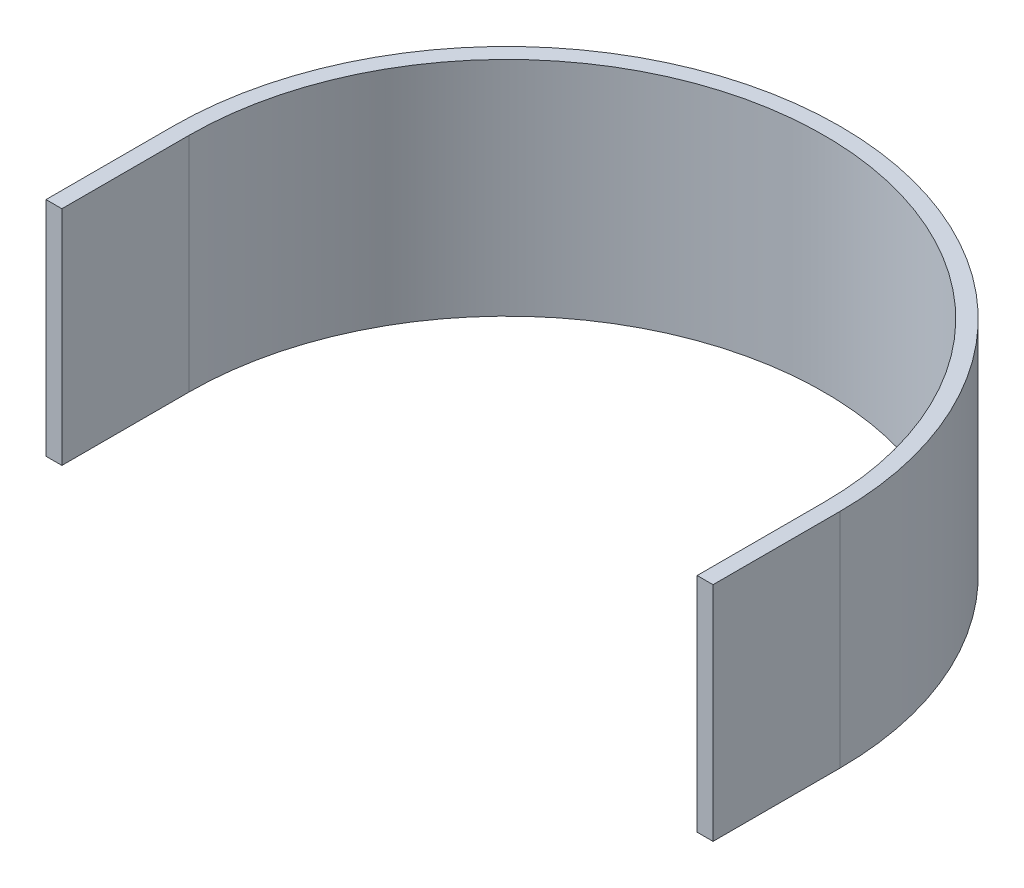
ISO-10303-21;
HEADER;
FILE_DESCRIPTION(('STEP AP214'),'2;1');
FILE_NAME('part.step','',(''),(''),'','','');
FILE_SCHEMA(('AUTOMOTIVE_DESIGN { 1 0 10303 214 1 1 1 1 }'));
ENDSEC;
DATA;
#1=APPLICATION_CONTEXT('core data for automotive mechanical design processes');
#2=APPLICATION_PROTOCOL_DEFINITION('international standard','automotive_design',2000,#1);
#3=PRODUCT_CONTEXT('',#1,'mechanical');
#4=PRODUCT('Part','Part','',(#3));
#5=PRODUCT_RELATED_PRODUCT_CATEGORY('part','',(#4));
#6=PRODUCT_DEFINITION_FORMATION('','',#4);
#7=PRODUCT_DEFINITION_CONTEXT('part definition',#1,'design');
#8=PRODUCT_DEFINITION('design','',#6,#7);
#9=PRODUCT_DEFINITION_SHAPE('','',#8);
#10=(LENGTH_UNIT() NAMED_UNIT(*) SI_UNIT(.MILLI.,.METRE.));
#11=(NAMED_UNIT(*) PLANE_ANGLE_UNIT() SI_UNIT($,.RADIAN.));
#12=(NAMED_UNIT(*) SI_UNIT($,.STERADIAN.) SOLID_ANGLE_UNIT());
#13=UNCERTAINTY_MEASURE_WITH_UNIT(LENGTH_MEASURE(1.E-05),#10,'distance_accuracy_value','');
#14=(GEOMETRIC_REPRESENTATION_CONTEXT(3) GLOBAL_UNCERTAINTY_ASSIGNED_CONTEXT((#13)) GLOBAL_UNIT_ASSIGNED_CONTEXT((#10,
#11,#12)) REPRESENTATION_CONTEXT('',''));
#15=CARTESIAN_POINT('',(0.,0.,0.));
#16=DIRECTION('',(0.,0.,1.));
#17=DIRECTION('',(1.,0.,0.));
#18=AXIS2_PLACEMENT_3D('',#15,#16,#17);
#19=CARTESIAN_POINT('',(0.,44.45,0.));
#20=DIRECTION('',(0.,-1.,0.));
#21=DIRECTION('',(0.,0.,-1.));
#22=AXIS2_PLACEMENT_3D('',#19,#20,#21);
#23=CYLINDRICAL_SURFACE('',#22,66.675);
#24=CARTESIAN_POINT('',(0.,0.,0.));
#25=DIRECTION('',(0.,1.,0.));
#26=DIRECTION('',(0.,0.,1.));
#27=AXIS2_PLACEMENT_3D('',#24,#25,#26);
#28=CIRCLE('',#27,66.675);
#29=CARTESIAN_POINT('',(-66.675,0.,0.));
#30=VERTEX_POINT('',#29);
#31=CARTESIAN_POINT('',(66.675,0.,0.));
#32=VERTEX_POINT('',#31);
#33=EDGE_CURVE('E129',#30,#32,#28,.F.);
#34=ORIENTED_EDGE('',*,*,#33,.F.);
#35=DIRECTION('',(0.,-1.,0.));
#36=VECTOR('',#35,1.);
#37=CARTESIAN_POINT('',(-66.675,44.45,0.));
#38=LINE('',#37,#36);
#39=CARTESIAN_POINT('',(-66.675,44.45,0.));
#40=VERTEX_POINT('',#39);
#41=EDGE_CURVE('E11',#40,#30,#38,.T.);
#42=ORIENTED_EDGE('',*,*,#41,.F.);
#43=CARTESIAN_POINT('',(0.,44.45,0.));
#44=DIRECTION('',(0.,1.,0.));
#45=DIRECTION('',(0.,0.,1.));
#46=AXIS2_PLACEMENT_3D('',#43,#44,#45);
#47=CIRCLE('',#46,66.675);
#48=CARTESIAN_POINT('',(66.675,44.45,0.));
#49=VERTEX_POINT('',#48);
#50=EDGE_CURVE('E147',#40,#49,#47,.F.);
#51=ORIENTED_EDGE('',*,*,#50,.T.);
#52=DIRECTION('',(0.,-1.,0.));
#53=VECTOR('',#52,1.);
#54=CARTESIAN_POINT('',(66.675,44.45,0.));
#55=LINE('',#54,#53);
#56=EDGE_CURVE('E87',#49,#32,#55,.T.);
#57=ORIENTED_EDGE('',*,*,#56,.T.);
#58=EDGE_LOOP('',(#34,#42,#51,#57));
#59=FACE_BOUND('',#58,.T.);
#60=ADVANCED_FACE('F36',(#59),#23,.T.);
#61=CARTESIAN_POINT('',(-66.675,44.45,0.));
#62=DIRECTION('',(-1.,0.,0.));
#63=DIRECTION('',(0.,0.,1.));
#64=AXIS2_PLACEMENT_3D('',#61,#62,#63);
#65=PLANE('',#64);
#66=DIRECTION('',(0.,0.,-1.));
#67=VECTOR('',#66,1.);
#68=CARTESIAN_POINT('',(-66.675,0.,0.));
#69=LINE('',#68,#67);
#70=CARTESIAN_POINT('',(-66.675,0.,25.4));
#71=VERTEX_POINT('',#70);
#72=EDGE_CURVE('E132',#71,#30,#69,.T.);
#73=ORIENTED_EDGE('',*,*,#72,.F.);
#74=DIRECTION('',(0.,-1.,0.));
#75=VECTOR('',#74,1.);
#76=CARTESIAN_POINT('',(-66.675,44.45,25.4));
#77=LINE('',#76,#75);
#78=CARTESIAN_POINT('',(-66.675,44.45,25.4));
#79=VERTEX_POINT('',#78);
#80=EDGE_CURVE('E44',#79,#71,#77,.T.);
#81=ORIENTED_EDGE('',*,*,#80,.F.);
#82=DIRECTION('',(0.,0.,-1.));
#83=VECTOR('',#82,1.);
#84=CARTESIAN_POINT('',(-66.675,44.45,0.));
#85=LINE('',#84,#83);
#86=EDGE_CURVE('E173',#79,#40,#85,.T.);
#87=ORIENTED_EDGE('',*,*,#86,.T.);
#88=ORIENTED_EDGE('',*,*,#41,.T.);
#89=EDGE_LOOP('',(#73,#81,#87,#88));
#90=FACE_BOUND('',#89,.T.);
#91=ADVANCED_FACE('F164',(#90),#65,.T.);
#92=CARTESIAN_POINT('',(0.,44.45,25.4));
#93=DIRECTION('',(0.,0.,1.));
#94=DIRECTION('',(1.,0.,0.));
#95=AXIS2_PLACEMENT_3D('',#92,#93,#94);
#96=PLANE('',#95);
#97=DIRECTION('',(-1.,0.,0.));
#98=VECTOR('',#97,1.);
#99=CARTESIAN_POINT('',(0.,0.,25.4));
#100=LINE('',#99,#98);
#101=CARTESIAN_POINT('',(-63.5,0.,25.4));
#102=VERTEX_POINT('',#101);
#103=EDGE_CURVE('E135',#102,#71,#100,.T.);
#104=ORIENTED_EDGE('',*,*,#103,.F.);
#105=DIRECTION('',(0.,-1.,0.));
#106=VECTOR('',#105,1.);
#107=CARTESIAN_POINT('',(-63.5,44.45,25.4));
#108=LINE('',#107,#106);
#109=CARTESIAN_POINT('',(-63.5,44.45,25.4));
#110=VERTEX_POINT('',#109);
#111=EDGE_CURVE('E153',#110,#102,#108,.T.);
#112=ORIENTED_EDGE('',*,*,#111,.F.);
#113=DIRECTION('',(-1.,0.,0.));
#114=VECTOR('',#113,1.);
#115=CARTESIAN_POINT('',(0.,44.45,25.4));
#116=LINE('',#115,#114);
#117=EDGE_CURVE('E160',#110,#79,#116,.T.);
#118=ORIENTED_EDGE('',*,*,#117,.T.);
#119=ORIENTED_EDGE('',*,*,#80,.T.);
#120=EDGE_LOOP('',(#104,#112,#118,#119));
#121=FACE_BOUND('',#120,.T.);
#122=ADVANCED_FACE('F158',(#121),#96,.T.);
#123=CARTESIAN_POINT('',(-63.5,44.45,0.));
#124=DIRECTION('',(1.,0.,0.));
#125=DIRECTION('',(0.,0.,-1.));
#126=AXIS2_PLACEMENT_3D('',#123,#124,#125);
#127=PLANE('',#126);
#128=DIRECTION('',(0.,0.,1.));
#129=VECTOR('',#128,1.);
#130=CARTESIAN_POINT('',(-63.5,0.,0.));
#131=LINE('',#130,#129);
#132=CARTESIAN_POINT('',(-63.5,0.,0.));
#133=VERTEX_POINT('',#132);
#134=EDGE_CURVE('E138',#133,#102,#131,.T.);
#135=ORIENTED_EDGE('',*,*,#134,.F.);
#136=DIRECTION('',(0.,-1.,0.));
#137=VECTOR('',#136,1.);
#138=CARTESIAN_POINT('',(-63.5,44.45,0.));
#139=LINE('',#138,#137);
#140=CARTESIAN_POINT('',(-63.5,44.45,0.));
#141=VERTEX_POINT('',#140);
#142=EDGE_CURVE('E151',#141,#133,#139,.T.);
#143=ORIENTED_EDGE('',*,*,#142,.F.);
#144=DIRECTION('',(0.,0.,1.));
#145=VECTOR('',#144,1.);
#146=CARTESIAN_POINT('',(-63.5,44.45,0.));
#147=LINE('',#146,#145);
#148=EDGE_CURVE('E172',#141,#110,#147,.T.);
#149=ORIENTED_EDGE('',*,*,#148,.T.);
#150=ORIENTED_EDGE('',*,*,#111,.T.);
#151=EDGE_LOOP('',(#135,#143,#149,#150));
#152=FACE_BOUND('',#151,.T.);
#153=ADVANCED_FACE('F170',(#152),#127,.T.);
#154=CARTESIAN_POINT('',(0.,44.45,0.));
#155=DIRECTION('',(0.,-1.,0.));
#156=DIRECTION('',(0.,0.,-1.));
#157=AXIS2_PLACEMENT_3D('',#154,#155,#156);
#158=CYLINDRICAL_SURFACE('',#157,63.5);
#159=CARTESIAN_POINT('',(0.,0.,0.));
#160=DIRECTION('',(0.,1.,0.));
#161=DIRECTION('',(0.,0.,1.));
#162=AXIS2_PLACEMENT_3D('',#159,#160,#161);
#163=CIRCLE('',#162,63.5);
#164=CARTESIAN_POINT('',(63.5,0.,0.));
#165=VERTEX_POINT('',#164);
#166=EDGE_CURVE('E141',#133,#165,#163,.F.);
#167=ORIENTED_EDGE('',*,*,#166,.T.);
#168=DIRECTION('',(0.,-1.,0.));
#169=VECTOR('',#168,1.);
#170=CARTESIAN_POINT('',(63.5,44.45,0.));
#171=LINE('',#170,#169);
#172=CARTESIAN_POINT('',(63.5,44.45,0.));
#173=VERTEX_POINT('',#172);
#174=EDGE_CURVE('E121',#173,#165,#171,.T.);
#175=ORIENTED_EDGE('',*,*,#174,.F.);
#176=CARTESIAN_POINT('',(0.,44.45,0.));
#177=DIRECTION('',(0.,1.,0.));
#178=DIRECTION('',(0.,0.,1.));
#179=AXIS2_PLACEMENT_3D('',#176,#177,#178);
#180=CIRCLE('',#179,63.5);
#181=EDGE_CURVE('E112',#141,#173,#180,.F.);
#182=ORIENTED_EDGE('',*,*,#181,.F.);
#183=ORIENTED_EDGE('',*,*,#142,.T.);
#184=EDGE_LOOP('',(#167,#175,#182,#183));
#185=FACE_BOUND('',#184,.T.);
#186=ADVANCED_FACE('F189',(#185),#158,.F.);
#187=CARTESIAN_POINT('',(63.5,44.45,0.));
#188=DIRECTION('',(1.,0.,0.));
#189=DIRECTION('',(0.,0.,-1.));
#190=AXIS2_PLACEMENT_3D('',#187,#188,#189);
#191=PLANE('',#190);
#192=DIRECTION('',(0.,0.,1.));
#193=VECTOR('',#192,1.);
#194=CARTESIAN_POINT('',(63.5,0.,0.));
#195=LINE('',#194,#193);
#196=CARTESIAN_POINT('',(63.5,0.,25.4));
#197=VERTEX_POINT('',#196);
#198=EDGE_CURVE('E120',#165,#197,#195,.T.);
#199=ORIENTED_EDGE('',*,*,#198,.T.);
#200=DIRECTION('',(0.,-1.,0.));
#201=VECTOR('',#200,1.);
#202=CARTESIAN_POINT('',(63.5,44.45,25.4));
#203=LINE('',#202,#201);
#204=CARTESIAN_POINT('',(63.5,44.45,25.4));
#205=VERTEX_POINT('',#204);
#206=EDGE_CURVE('E117',#205,#197,#203,.T.);
#207=ORIENTED_EDGE('',*,*,#206,.F.);
#208=DIRECTION('',(0.,0.,1.));
#209=VECTOR('',#208,1.);
#210=CARTESIAN_POINT('',(63.5,44.45,0.));
#211=LINE('',#210,#209);
#212=EDGE_CURVE('E105',#173,#205,#211,.T.);
#213=ORIENTED_EDGE('',*,*,#212,.F.);
#214=ORIENTED_EDGE('',*,*,#174,.T.);
#215=EDGE_LOOP('',(#199,#207,#213,#214));
#216=FACE_BOUND('',#215,.T.);
#217=ADVANCED_FACE('F118',(#216),#191,.F.);
#218=CARTESIAN_POINT('',(0.,44.45,25.4));
#219=DIRECTION('',(0.,0.,-1.));
#220=DIRECTION('',(-1.,0.,0.));
#221=AXIS2_PLACEMENT_3D('',#218,#219,#220);
#222=PLANE('',#221);
#223=DIRECTION('',(1.,0.,0.));
#224=VECTOR('',#223,1.);
#225=CARTESIAN_POINT('',(0.,0.,25.4));
#226=LINE('',#225,#224);
#227=CARTESIAN_POINT('',(66.675,0.,25.4));
#228=VERTEX_POINT('',#227);
#229=EDGE_CURVE('E80',#197,#228,#226,.T.);
#230=ORIENTED_EDGE('',*,*,#229,.T.);
#231=DIRECTION('',(0.,-1.,0.));
#232=VECTOR('',#231,1.);
#233=CARTESIAN_POINT('',(66.675,44.45,25.4));
#234=LINE('',#233,#232);
#235=CARTESIAN_POINT('',(66.675,44.45,25.4));
#236=VERTEX_POINT('',#235);
#237=EDGE_CURVE('E122',#236,#228,#234,.T.);
#238=ORIENTED_EDGE('',*,*,#237,.F.);
#239=DIRECTION('',(1.,0.,0.));
#240=VECTOR('',#239,1.);
#241=CARTESIAN_POINT('',(0.,44.45,25.4));
#242=LINE('',#241,#240);
#243=EDGE_CURVE('E109',#205,#236,#242,.T.);
#244=ORIENTED_EDGE('',*,*,#243,.F.);
#245=ORIENTED_EDGE('',*,*,#206,.T.);
#246=EDGE_LOOP('',(#230,#238,#244,#245));
#247=FACE_BOUND('',#246,.T.);
#248=ADVANCED_FACE('F124',(#247),#222,.F.);
#249=CARTESIAN_POINT('',(66.675,44.45,0.));
#250=DIRECTION('',(-1.,0.,0.));
#251=DIRECTION('',(0.,0.,1.));
#252=AXIS2_PLACEMENT_3D('',#249,#250,#251);
#253=PLANE('',#252);
#254=DIRECTION('',(0.,0.,-1.));
#255=VECTOR('',#254,1.);
#256=CARTESIAN_POINT('',(66.675,0.,0.));
#257=LINE('',#256,#255);
#258=EDGE_CURVE('E145',#228,#32,#257,.T.);
#259=ORIENTED_EDGE('',*,*,#258,.T.);
#260=ORIENTED_EDGE('',*,*,#56,.F.);
#261=DIRECTION('',(0.,0.,-1.));
#262=VECTOR('',#261,1.);
#263=CARTESIAN_POINT('',(66.675,44.45,0.));
#264=LINE('',#263,#262);
#265=EDGE_CURVE('E52',#236,#49,#264,.T.);
#266=ORIENTED_EDGE('',*,*,#265,.F.);
#267=ORIENTED_EDGE('',*,*,#237,.T.);
#268=EDGE_LOOP('',(#259,#260,#266,#267));
#269=FACE_BOUND('',#268,.T.);
#270=ADVANCED_FACE('F197',(#269),#253,.F.);
#271=CARTESIAN_POINT('',(0.,44.45,0.));
#272=DIRECTION('',(0.,1.,0.));
#273=DIRECTION('',(0.,0.,1.));
#274=AXIS2_PLACEMENT_3D('',#271,#272,#273);
#275=PLANE('',#274);
#276=ORIENTED_EDGE('',*,*,#50,.F.);
#277=ORIENTED_EDGE('',*,*,#86,.F.);
#278=ORIENTED_EDGE('',*,*,#117,.F.);
#279=ORIENTED_EDGE('',*,*,#148,.F.);
#280=ORIENTED_EDGE('',*,*,#181,.T.);
#281=ORIENTED_EDGE('',*,*,#212,.T.);
#282=ORIENTED_EDGE('',*,*,#243,.T.);
#283=ORIENTED_EDGE('',*,*,#265,.T.);
#284=EDGE_LOOP('',(#276,#277,#278,#279,#280,#281,#282,#283));
#285=FACE_BOUND('',#284,.T.);
#286=ADVANCED_FACE('F107',(#285),#275,.T.);
#287=CARTESIAN_POINT('',(0.,0.,0.));
#288=DIRECTION('',(0.,1.,0.));
#289=DIRECTION('',(0.,0.,1.));
#290=AXIS2_PLACEMENT_3D('',#287,#288,#289);
#291=PLANE('',#290);
#292=ORIENTED_EDGE('',*,*,#33,.T.);
#293=ORIENTED_EDGE('',*,*,#258,.F.);
#294=ORIENTED_EDGE('',*,*,#229,.F.);
#295=ORIENTED_EDGE('',*,*,#198,.F.);
#296=ORIENTED_EDGE('',*,*,#166,.F.);
#297=ORIENTED_EDGE('',*,*,#134,.T.);
#298=ORIENTED_EDGE('',*,*,#103,.T.);
#299=ORIENTED_EDGE('',*,*,#72,.T.);
#300=EDGE_LOOP('',(#292,#293,#294,#295,#296,#297,#298,#299));
#301=FACE_BOUND('',#300,.T.);
#302=ADVANCED_FACE('F166',(#301),#291,.F.);
#303=CLOSED_SHELL('',(#60,#91,#122,#153,#186,#217,#248,#270,#286,#302));
#304=MANIFOLD_SOLID_BREP('B2',#303);
#305=ADVANCED_BREP_SHAPE_REPRESENTATION('',(#18,#304),#14);
#306=SHAPE_DEFINITION_REPRESENTATION(#9,#305);
ENDSEC;
END-ISO-10303-21;
